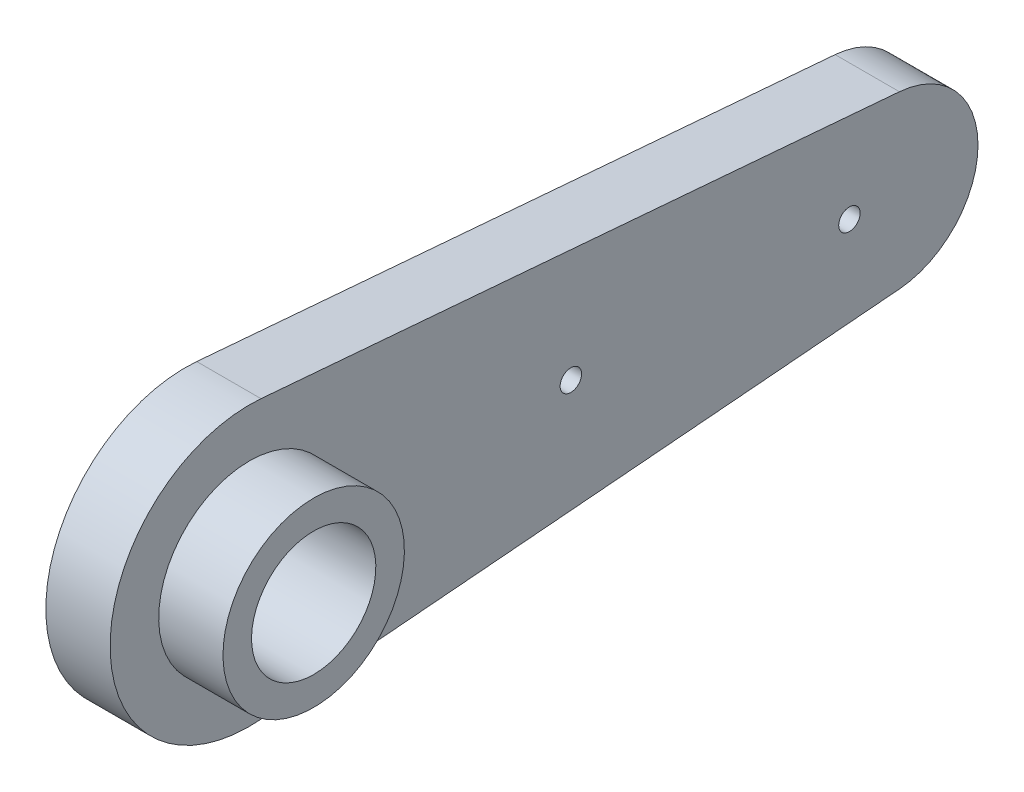
ISO-10303-21;
HEADER;
FILE_DESCRIPTION(('STEP AP214'),'2;1');
FILE_NAME('part.step','',(''),(''),'','','');
FILE_SCHEMA(('AUTOMOTIVE_DESIGN { 1 0 10303 214 1 1 1 1 }'));
ENDSEC;
DATA;
#1=APPLICATION_CONTEXT('core data for automotive mechanical design processes');
#2=APPLICATION_PROTOCOL_DEFINITION('international standard','automotive_design',2000,#1);
#3=PRODUCT_CONTEXT('',#1,'mechanical');
#4=PRODUCT('Part','Part','',(#3));
#5=PRODUCT_RELATED_PRODUCT_CATEGORY('part','',(#4));
#6=PRODUCT_DEFINITION_FORMATION('','',#4);
#7=PRODUCT_DEFINITION_CONTEXT('part definition',#1,'design');
#8=PRODUCT_DEFINITION('design','',#6,#7);
#9=PRODUCT_DEFINITION_SHAPE('','',#8);
#10=(LENGTH_UNIT() NAMED_UNIT(*) SI_UNIT(.MILLI.,.METRE.));
#11=(NAMED_UNIT(*) PLANE_ANGLE_UNIT() SI_UNIT($,.RADIAN.));
#12=(NAMED_UNIT(*) SI_UNIT($,.STERADIAN.) SOLID_ANGLE_UNIT());
#13=UNCERTAINTY_MEASURE_WITH_UNIT(LENGTH_MEASURE(1.E-05),#10,'distance_accuracy_value','');
#14=(GEOMETRIC_REPRESENTATION_CONTEXT(3) GLOBAL_UNCERTAINTY_ASSIGNED_CONTEXT((#13)) GLOBAL_UNIT_ASSIGNED_CONTEXT((#10,
#11,#12)) REPRESENTATION_CONTEXT('',''));
#15=CARTESIAN_POINT('',(0.,0.,0.));
#16=DIRECTION('',(0.,0.,1.));
#17=DIRECTION('',(1.,0.,0.));
#18=AXIS2_PLACEMENT_3D('',#15,#16,#17);
#19=CARTESIAN_POINT('',(51.2,-63.9,-16.4190588916441));
#20=DIRECTION('',(-1.,0.,0.));
#21=DIRECTION('',(0.,-1.,0.));
#22=AXIS2_PLACEMENT_3D('',#19,#20,#21);
#23=PLANE('',#22);
#24=CARTESIAN_POINT('',(51.2,-63.9,-16.4190588916441));
#25=DIRECTION('',(-1.,0.,0.));
#26=DIRECTION('',(0.,-1.,0.));
#27=AXIS2_PLACEMENT_3D('',#24,#25,#26);
#28=CIRCLE('',#27,2.9);
#29=CARTESIAN_POINT('',(51.2,-66.8,-16.4190588916441));
#30=VERTEX_POINT('',#29);
#31=EDGE_CURVE('E105',#30,#30,#28,.T.);
#32=ORIENTED_EDGE('',*,*,#31,.T.);
#33=EDGE_LOOP('',(#32));
#34=FACE_BOUND('',#33,.T.);
#35=CARTESIAN_POINT('',(51.2,-63.9,-16.4190588916441));
#36=DIRECTION('',(1.,0.,0.));
#37=DIRECTION('',(0.,1.,0.));
#38=AXIS2_PLACEMENT_3D('',#35,#36,#37);
#39=CIRCLE('',#38,4.23295652723474);
#40=CARTESIAN_POINT('',(51.2,-59.6670434727652,-16.4190588916441));
#41=VERTEX_POINT('',#40);
#42=EDGE_CURVE('E122',#41,#41,#39,.T.);
#43=ORIENTED_EDGE('',*,*,#42,.T.);
#44=EDGE_LOOP('',(#43));
#45=FACE_BOUND('',#44,.T.);
#46=ADVANCED_FACE('F33',(#34,#45),#23,.F.);
#47=CARTESIAN_POINT('',(45.2,-63.9,-16.4190588916441));
#48=DIRECTION('',(1.,0.,0.));
#49=DIRECTION('',(0.,1.,0.));
#50=AXIS2_PLACEMENT_3D('',#47,#48,#49);
#51=CYLINDRICAL_SURFACE('',#50,6.49999999999999);
#52=CARTESIAN_POINT('',(48.2,-63.9,-16.4190588916441));
#53=DIRECTION('',(1.,0.,0.));
#54=DIRECTION('',(0.,1.,0.));
#55=AXIS2_PLACEMENT_3D('',#52,#53,#54);
#56=CIRCLE('',#55,6.49999999999999);
#57=CARTESIAN_POINT('',(48.2,-57.4226087641534,-16.9607255583108));
#58=VERTEX_POINT('',#57);
#59=CARTESIAN_POINT('',(48.2,-70.3773912358465,-16.9607255583108));
#60=VERTEX_POINT('',#59);
#61=EDGE_CURVE('E49',#58,#60,#56,.T.);
#62=ORIENTED_EDGE('',*,*,#61,.F.);
#63=DIRECTION('',(1.,0.,0.));
#64=VECTOR('',#63,1.);
#65=CARTESIAN_POINT('',(45.2,-57.4226087641534,-16.9607255583108));
#66=LINE('',#65,#64);
#67=CARTESIAN_POINT('',(45.2,-57.4226087641534,-16.9607255583108));
#68=VERTEX_POINT('',#67);
#69=EDGE_CURVE('E11',#68,#58,#66,.T.);
#70=ORIENTED_EDGE('',*,*,#69,.F.);
#71=CARTESIAN_POINT('',(45.2,-63.9,-16.4190588916441));
#72=DIRECTION('',(-1.,0.,0.));
#73=DIRECTION('',(0.,-1.,0.));
#74=AXIS2_PLACEMENT_3D('',#71,#72,#73);
#75=CIRCLE('',#74,6.49999999999999);
#76=CARTESIAN_POINT('',(45.2,-70.3773912358465,-16.9607255583108));
#77=VERTEX_POINT('',#76);
#78=EDGE_CURVE('E102',#77,#68,#75,.T.);
#79=ORIENTED_EDGE('',*,*,#78,.F.);
#80=DIRECTION('',(1.,0.,0.));
#81=VECTOR('',#80,1.);
#82=CARTESIAN_POINT('',(45.2,-70.3773912358465,-16.9607255583108));
#83=LINE('',#82,#81);
#84=EDGE_CURVE('E92',#77,#60,#83,.T.);
#85=ORIENTED_EDGE('',*,*,#84,.T.);
#86=EDGE_LOOP('',(#62,#70,#79,#85));
#87=FACE_BOUND('',#86,.T.);
#88=ADVANCED_FACE('F35',(#87),#51,.T.);
#89=CARTESIAN_POINT('',(45.2,-57.4226087641534,-16.9607255583108));
#90=DIRECTION('',(0.,-0.996521728591783,0.0833333333333332));
#91=DIRECTION('',(0.,-0.0833333333333332,-0.996521728591783));
#92=AXIS2_PLACEMENT_3D('',#89,#90,#91);
#93=PLANE('',#92);
#94=DIRECTION('',(0.,0.0833333333333332,0.996521728591783));
#95=VECTOR('',#94,1.);
#96=CARTESIAN_POINT('',(48.2,-59.9139130856328,-46.7523922249774));
#97=LINE('',#96,#95);
#98=CARTESIAN_POINT('',(48.2,-59.9139130856328,-46.7523922249774));
#99=VERTEX_POINT('',#98);
#100=EDGE_CURVE('E89',#99,#58,#97,.T.);
#101=ORIENTED_EDGE('',*,*,#100,.F.);
#102=DIRECTION('',(1.,0.,0.));
#103=VECTOR('',#102,1.);
#104=CARTESIAN_POINT('',(45.2,-59.9139130856328,-46.7523922249774));
#105=LINE('',#104,#103);
#106=CARTESIAN_POINT('',(45.2,-59.9139130856328,-46.7523922249774));
#107=VERTEX_POINT('',#106);
#108=EDGE_CURVE('E42',#107,#99,#105,.T.);
#109=ORIENTED_EDGE('',*,*,#108,.F.);
#110=DIRECTION('',(0.,-0.0833333333333332,-0.996521728591783));
#111=VECTOR('',#110,1.);
#112=CARTESIAN_POINT('',(45.2,-57.4226087641534,-16.9607255583108));
#113=LINE('',#112,#111);
#114=EDGE_CURVE('E100',#68,#107,#113,.T.);
#115=ORIENTED_EDGE('',*,*,#114,.F.);
#116=ORIENTED_EDGE('',*,*,#69,.T.);
#117=EDGE_LOOP('',(#101,#109,#115,#116));
#118=FACE_BOUND('',#117,.T.);
#119=ADVANCED_FACE('F152',(#118),#93,.F.);
#120=CARTESIAN_POINT('',(45.2,-63.9,-46.4190588916441));
#121=DIRECTION('',(1.,0.,0.));
#122=DIRECTION('',(0.,1.,0.));
#123=AXIS2_PLACEMENT_3D('',#120,#121,#122);
#124=CYLINDRICAL_SURFACE('',#123,3.99999999999999);
#125=CARTESIAN_POINT('',(48.2,-63.9,-46.4190588916441));
#126=DIRECTION('',(1.,0.,0.));
#127=DIRECTION('',(0.,1.,0.));
#128=AXIS2_PLACEMENT_3D('',#125,#126,#127);
#129=CIRCLE('',#128,3.99999999999999);
#130=CARTESIAN_POINT('',(48.2,-67.8860869143671,-46.7523922249774));
#131=VERTEX_POINT('',#130);
#132=EDGE_CURVE('E76',#131,#99,#129,.T.);
#133=ORIENTED_EDGE('',*,*,#132,.F.);
#134=DIRECTION('',(1.,0.,0.));
#135=VECTOR('',#134,1.);
#136=CARTESIAN_POINT('',(45.2,-67.8860869143671,-46.7523922249774));
#137=LINE('',#136,#135);
#138=CARTESIAN_POINT('',(45.2,-67.8860869143671,-46.7523922249774));
#139=VERTEX_POINT('',#138);
#140=EDGE_CURVE('E87',#139,#131,#137,.T.);
#141=ORIENTED_EDGE('',*,*,#140,.F.);
#142=CARTESIAN_POINT('',(45.2,-63.9,-46.4190588916441));
#143=DIRECTION('',(-1.,0.,0.));
#144=DIRECTION('',(0.,-1.,0.));
#145=AXIS2_PLACEMENT_3D('',#142,#143,#144);
#146=CIRCLE('',#145,3.99999999999999);
#147=EDGE_CURVE('E98',#107,#139,#146,.T.);
#148=ORIENTED_EDGE('',*,*,#147,.F.);
#149=ORIENTED_EDGE('',*,*,#108,.T.);
#150=EDGE_LOOP('',(#133,#141,#148,#149));
#151=FACE_BOUND('',#150,.T.);
#152=ADVANCED_FACE('F85',(#151),#124,.T.);
#153=CARTESIAN_POINT('',(45.2,-70.3773912358465,-16.9607255583108));
#154=DIRECTION('',(0.,0.996521728591783,0.0833333333333332));
#155=DIRECTION('',(0.,-0.0833333333333332,0.996521728591783));
#156=AXIS2_PLACEMENT_3D('',#153,#154,#155);
#157=PLANE('',#156);
#158=DIRECTION('',(0.,0.0833333333333332,-0.996521728591783));
#159=VECTOR('',#158,1.);
#160=CARTESIAN_POINT('',(48.2,-70.3773912358465,-16.9607255583108));
#161=LINE('',#160,#159);
#162=EDGE_CURVE('E73',#60,#131,#161,.T.);
#163=ORIENTED_EDGE('',*,*,#162,.F.);
#164=ORIENTED_EDGE('',*,*,#84,.F.);
#165=DIRECTION('',(0.,-0.0833333333333332,0.996521728591783));
#166=VECTOR('',#165,1.);
#167=CARTESIAN_POINT('',(45.2,-70.3773912358465,-16.9607255583108));
#168=LINE('',#167,#166);
#169=EDGE_CURVE('E57',#139,#77,#168,.T.);
#170=ORIENTED_EDGE('',*,*,#169,.F.);
#171=ORIENTED_EDGE('',*,*,#140,.T.);
#172=EDGE_LOOP('',(#163,#164,#170,#171));
#173=FACE_BOUND('',#172,.T.);
#174=ADVANCED_FACE('F91',(#173),#157,.F.);
#175=CARTESIAN_POINT('',(45.2,-63.9,-31.4190588916441));
#176=DIRECTION('',(1.,0.,0.));
#177=DIRECTION('',(0.,1.,0.));
#178=AXIS2_PLACEMENT_3D('',#175,#176,#177);
#179=CYLINDRICAL_SURFACE('',#178,0.499999999999999);
#180=CARTESIAN_POINT('',(45.2,-63.9,-31.4190588916441));
#181=DIRECTION('',(-1.,0.,0.));
#182=DIRECTION('',(0.,-1.,0.));
#183=AXIS2_PLACEMENT_3D('',#180,#181,#182);
#184=CIRCLE('',#183,0.499999999999999);
#185=CARTESIAN_POINT('',(45.2,-64.4,-31.4190588916441));
#186=VERTEX_POINT('',#185);
#187=EDGE_CURVE('E108',#186,#186,#184,.T.);
#188=ORIENTED_EDGE('',*,*,#187,.T.);
#189=EDGE_LOOP('',(#188));
#190=FACE_BOUND('',#189,.T.);
#191=CARTESIAN_POINT('',(48.2,-63.9,-31.4190588916441));
#192=DIRECTION('',(1.,0.,0.));
#193=DIRECTION('',(0.,1.,0.));
#194=AXIS2_PLACEMENT_3D('',#191,#192,#193);
#195=CIRCLE('',#194,0.499999999999999);
#196=CARTESIAN_POINT('',(48.2,-63.4,-31.4190588916441));
#197=VERTEX_POINT('',#196);
#198=EDGE_CURVE('E116',#197,#197,#195,.T.);
#199=ORIENTED_EDGE('',*,*,#198,.T.);
#200=EDGE_LOOP('',(#199));
#201=FACE_BOUND('',#200,.T.);
#202=ADVANCED_FACE('F159',(#190,#201),#179,.F.);
#203=CARTESIAN_POINT('',(45.2,-63.9,-44.4190588916441));
#204=DIRECTION('',(1.,0.,0.));
#205=DIRECTION('',(0.,1.,0.));
#206=AXIS2_PLACEMENT_3D('',#203,#204,#205);
#207=CYLINDRICAL_SURFACE('',#206,0.499999999999999);
#208=CARTESIAN_POINT('',(45.2,-63.9,-44.4190588916441));
#209=DIRECTION('',(-1.,0.,0.));
#210=DIRECTION('',(0.,-1.,0.));
#211=AXIS2_PLACEMENT_3D('',#208,#209,#210);
#212=CIRCLE('',#211,0.499999999999999);
#213=CARTESIAN_POINT('',(45.2,-64.4,-44.4190588916441));
#214=VERTEX_POINT('',#213);
#215=EDGE_CURVE('E113',#214,#214,#212,.T.);
#216=ORIENTED_EDGE('',*,*,#215,.T.);
#217=EDGE_LOOP('',(#216));
#218=FACE_BOUND('',#217,.T.);
#219=CARTESIAN_POINT('',(48.2,-63.9,-44.4190588916441));
#220=DIRECTION('',(1.,0.,0.));
#221=DIRECTION('',(0.,1.,0.));
#222=AXIS2_PLACEMENT_3D('',#219,#220,#221);
#223=CIRCLE('',#222,0.499999999999999);
#224=CARTESIAN_POINT('',(48.2,-63.4,-44.4190588916441));
#225=VERTEX_POINT('',#224);
#226=EDGE_CURVE('E37',#225,#225,#223,.T.);
#227=ORIENTED_EDGE('',*,*,#226,.T.);
#228=EDGE_LOOP('',(#227));
#229=FACE_BOUND('',#228,.T.);
#230=ADVANCED_FACE('F169',(#218,#229),#207,.F.);
#231=CARTESIAN_POINT('',(45.2,-63.9,-16.4190588916441));
#232=DIRECTION('',(-1.,0.,0.));
#233=DIRECTION('',(0.,-1.,0.));
#234=AXIS2_PLACEMENT_3D('',#231,#232,#233);
#235=PLANE('',#234);
#236=ORIENTED_EDGE('',*,*,#187,.F.);
#237=EDGE_LOOP('',(#236));
#238=FACE_BOUND('',#237,.T.);
#239=ORIENTED_EDGE('',*,*,#78,.T.);
#240=ORIENTED_EDGE('',*,*,#114,.T.);
#241=ORIENTED_EDGE('',*,*,#147,.T.);
#242=ORIENTED_EDGE('',*,*,#169,.T.);
#243=EDGE_LOOP('',(#239,#240,#241,#242));
#244=FACE_BOUND('',#243,.T.);
#245=CARTESIAN_POINT('',(45.2,-63.9,-16.4190588916441));
#246=DIRECTION('',(-1.,0.,0.));
#247=DIRECTION('',(0.,-1.,0.));
#248=AXIS2_PLACEMENT_3D('',#245,#246,#247);
#249=CIRCLE('',#248,2.9);
#250=CARTESIAN_POINT('',(45.2,-66.8,-16.4190588916441));
#251=VERTEX_POINT('',#250);
#252=EDGE_CURVE('E104',#251,#251,#249,.T.);
#253=ORIENTED_EDGE('',*,*,#252,.F.);
#254=EDGE_LOOP('',(#253));
#255=FACE_BOUND('',#254,.T.);
#256=ORIENTED_EDGE('',*,*,#215,.F.);
#257=EDGE_LOOP('',(#256));
#258=FACE_BOUND('',#257,.T.);
#259=ADVANCED_FACE('F140',(#238,#244,#255,#258),#235,.T.);
#260=CARTESIAN_POINT('',(45.2,-63.9,-16.4190588916441));
#261=DIRECTION('',(1.,0.,0.));
#262=DIRECTION('',(0.,1.,0.));
#263=AXIS2_PLACEMENT_3D('',#260,#261,#262);
#264=CYLINDRICAL_SURFACE('',#263,2.9);
#265=ORIENTED_EDGE('',*,*,#252,.T.);
#266=EDGE_LOOP('',(#265));
#267=FACE_BOUND('',#266,.T.);
#268=ORIENTED_EDGE('',*,*,#31,.F.);
#269=EDGE_LOOP('',(#268));
#270=FACE_BOUND('',#269,.T.);
#271=ADVANCED_FACE('F132',(#267,#270),#264,.F.);
#272=CARTESIAN_POINT('',(48.2,-63.9,-16.4190588916441));
#273=DIRECTION('',(1.,0.,0.));
#274=DIRECTION('',(0.,1.,0.));
#275=AXIS2_PLACEMENT_3D('',#272,#273,#274);
#276=PLANE('',#275);
#277=ORIENTED_EDGE('',*,*,#198,.F.);
#278=EDGE_LOOP('',(#277));
#279=FACE_BOUND('',#278,.T.);
#280=ORIENTED_EDGE('',*,*,#226,.F.);
#281=EDGE_LOOP('',(#280));
#282=FACE_BOUND('',#281,.T.);
#283=CARTESIAN_POINT('',(48.2,-63.9,-16.4190588916441));
#284=DIRECTION('',(1.,0.,0.));
#285=DIRECTION('',(0.,1.,0.));
#286=AXIS2_PLACEMENT_3D('',#283,#284,#285);
#287=CIRCLE('',#286,4.23295652723474);
#288=CARTESIAN_POINT('',(48.2,-59.6670434727652,-16.4190588916441));
#289=VERTEX_POINT('',#288);
#290=EDGE_CURVE('E121',#289,#289,#287,.T.);
#291=ORIENTED_EDGE('',*,*,#290,.F.);
#292=EDGE_LOOP('',(#291));
#293=FACE_BOUND('',#292,.T.);
#294=ORIENTED_EDGE('',*,*,#61,.T.);
#295=ORIENTED_EDGE('',*,*,#162,.T.);
#296=ORIENTED_EDGE('',*,*,#132,.T.);
#297=ORIENTED_EDGE('',*,*,#100,.T.);
#298=EDGE_LOOP('',(#294,#295,#296,#297));
#299=FACE_BOUND('',#298,.T.);
#300=ADVANCED_FACE('F75',(#279,#282,#293,#299),#276,.T.);
#301=CARTESIAN_POINT('',(48.2,-63.9,-16.4190588916441));
#302=DIRECTION('',(1.,0.,0.));
#303=DIRECTION('',(0.,1.,0.));
#304=AXIS2_PLACEMENT_3D('',#301,#302,#303);
#305=CYLINDRICAL_SURFACE('',#304,4.23295652723474);
#306=ORIENTED_EDGE('',*,*,#290,.T.);
#307=EDGE_LOOP('',(#306));
#308=FACE_BOUND('',#307,.T.);
#309=ORIENTED_EDGE('',*,*,#42,.F.);
#310=EDGE_LOOP('',(#309));
#311=FACE_BOUND('',#310,.T.);
#312=ADVANCED_FACE('F128',(#308,#311),#305,.T.);
#313=CLOSED_SHELL('',(#46,#88,#119,#152,#174,#202,#230,#259,#271,#300,#312));
#314=MANIFOLD_SOLID_BREP('B2',#313);
#315=ADVANCED_BREP_SHAPE_REPRESENTATION('',(#18,#314),#14);
#316=SHAPE_DEFINITION_REPRESENTATION(#9,#315);
ENDSEC;
END-ISO-10303-21;
